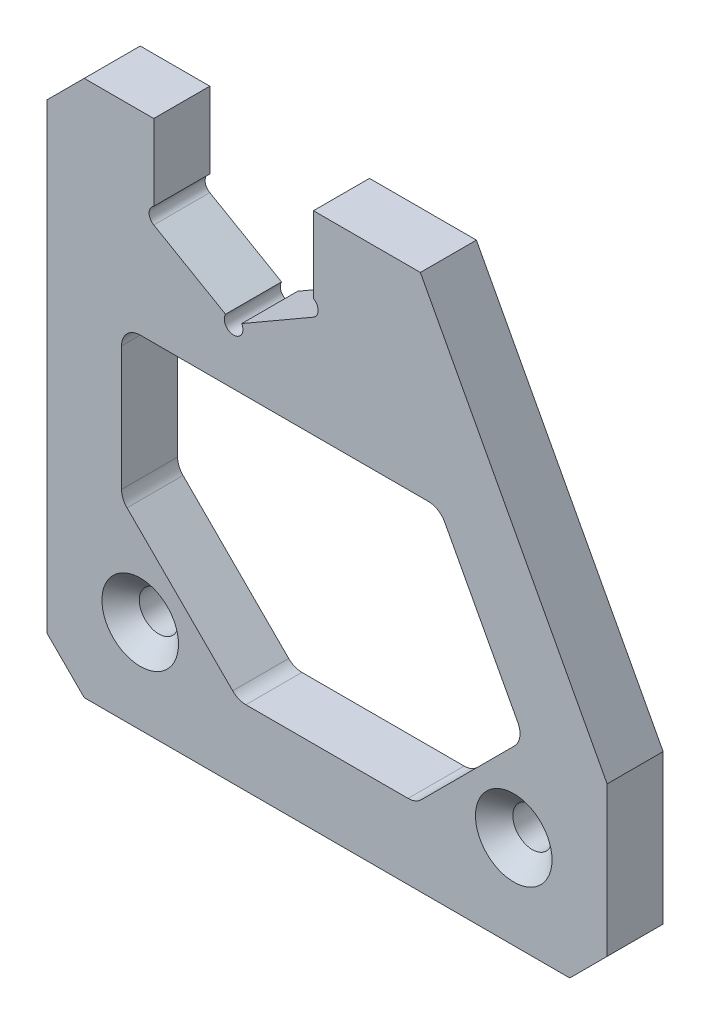
ISO-10303-21;
HEADER;
FILE_DESCRIPTION(('STEP AP214'),'2;1');
FILE_NAME('part.step','',(''),(''),'','','');
FILE_SCHEMA(('AUTOMOTIVE_DESIGN { 1 0 10303 214 1 1 1 1 }'));
ENDSEC;
DATA;
#1=APPLICATION_CONTEXT('core data for automotive mechanical design processes');
#2=APPLICATION_PROTOCOL_DEFINITION('international standard','automotive_design',2000,#1);
#3=PRODUCT_CONTEXT('',#1,'mechanical');
#4=PRODUCT('Part','Part','',(#3));
#5=PRODUCT_RELATED_PRODUCT_CATEGORY('part','',(#4));
#6=PRODUCT_DEFINITION_FORMATION('','',#4);
#7=PRODUCT_DEFINITION_CONTEXT('part definition',#1,'design');
#8=PRODUCT_DEFINITION('design','',#6,#7);
#9=PRODUCT_DEFINITION_SHAPE('','',#8);
#10=(LENGTH_UNIT() NAMED_UNIT(*) SI_UNIT(.MILLI.,.METRE.));
#11=(NAMED_UNIT(*) PLANE_ANGLE_UNIT() SI_UNIT($,.RADIAN.));
#12=(NAMED_UNIT(*) SI_UNIT($,.STERADIAN.) SOLID_ANGLE_UNIT());
#13=UNCERTAINTY_MEASURE_WITH_UNIT(LENGTH_MEASURE(1.E-05),#10,'distance_accuracy_value','');
#14=(GEOMETRIC_REPRESENTATION_CONTEXT(3) GLOBAL_UNCERTAINTY_ASSIGNED_CONTEXT((#13)) GLOBAL_UNIT_ASSIGNED_CONTEXT((#10,
#11,#12)) REPRESENTATION_CONTEXT('',''));
#15=CARTESIAN_POINT('',(0.,0.,0.));
#16=DIRECTION('',(0.,0.,1.));
#17=DIRECTION('',(1.,0.,0.));
#18=AXIS2_PLACEMENT_3D('',#15,#16,#17);
#19=CARTESIAN_POINT('',(0.,0.,3.));
#20=DIRECTION('',(0.,0.,1.));
#21=DIRECTION('',(1.,0.,0.));
#22=AXIS2_PLACEMENT_3D('',#19,#20,#21);
#23=PLANE('',#22);
#24=CARTESIAN_POINT('',(30.,-42.5,3.));
#25=DIRECTION('',(0.,0.,1.));
#26=DIRECTION('',(1.,0.,0.));
#27=AXIS2_PLACEMENT_3D('',#24,#25,#26);
#28=CIRCLE('',#27,4.10000000000001);
#29=CARTESIAN_POINT('',(34.1,-42.5,3.));
#30=VERTEX_POINT('',#29);
#31=EDGE_CURVE('E46',#30,#30,#28,.F.);
#32=ORIENTED_EDGE('',*,*,#31,.T.);
#33=EDGE_LOOP('',(#32));
#34=FACE_BOUND('',#33,.T.);
#35=CARTESIAN_POINT('',(-9.99999999999999,-42.5,3.));
#36=DIRECTION('',(0.,0.,1.));
#37=DIRECTION('',(1.,0.,0.));
#38=AXIS2_PLACEMENT_3D('',#35,#36,#37);
#39=CIRCLE('',#38,4.09999999999999);
#40=CARTESIAN_POINT('',(-5.90000000000001,-42.5,3.));
#41=VERTEX_POINT('',#40);
#42=EDGE_CURVE('E405',#41,#41,#39,.F.);
#43=ORIENTED_EDGE('',*,*,#42,.T.);
#44=EDGE_LOOP('',(#43));
#45=FACE_BOUND('',#44,.T.);
#46=DIRECTION('',(-1.,0.,0.));
#47=VECTOR('',#46,1.);
#48=CARTESIAN_POINT('',(-12.,-15.8726896031426,3.));
#49=LINE('',#48,#47);
#50=CARTESIAN_POINT('',(20.8478991758066,-15.8726896031426,3.));
#51=VERTEX_POINT('',#50);
#52=CARTESIAN_POINT('',(-10.,-15.8726896031426,3.));
#53=VERTEX_POINT('',#52);
#54=EDGE_CURVE('E458',#51,#53,#49,.T.);
#55=ORIENTED_EDGE('',*,*,#54,.F.);
#56=CARTESIAN_POINT('',(20.8478991758066,-17.8726896031426,3.));
#57=DIRECTION('',(0.,0.,1.));
#58=DIRECTION('',(1.,0.,0.));
#59=AXIS2_PLACEMENT_3D('',#56,#57,#58);
#60=CIRCLE('',#59,2.);
#61=CARTESIAN_POINT('',(22.6119403690712,-16.930267898986,3.));
#62=VERTEX_POINT('',#61);
#63=EDGE_CURVE('E395',#51,#62,#60,.F.);
#64=ORIENTED_EDGE('',*,*,#63,.T.);
#65=DIRECTION('',(-0.471210852078323,0.882020596632313,0.));
#66=VECTOR('',#65,1.);
#67=CARTESIAN_POINT('',(22.0469395382214,-15.8726896031426,3.));
#68=LINE('',#67,#66);
#69=CARTESIAN_POINT('',(30.4347580639227,-31.5731529262005,3.));
#70=VERTEX_POINT('',#69);
#71=EDGE_CURVE('E442',#70,#62,#68,.T.);
#72=ORIENTED_EDGE('',*,*,#71,.F.);
#73=CARTESIAN_POINT('',(28.670716870658,-32.5155746303572,3.));
#74=DIRECTION('',(0.,0.,1.));
#75=DIRECTION('',(1.,0.,0.));
#76=AXIS2_PLACEMENT_3D('',#73,#74,#75);
#77=CIRCLE('',#76,2.);
#78=CARTESIAN_POINT('',(30.0849304330311,-33.9297881927302,3.));
#79=VERTEX_POINT('',#78);
#80=EDGE_CURVE('E379',#70,#79,#77,.F.);
#81=ORIENTED_EDGE('',*,*,#80,.T.);
#82=DIRECTION('',(0.707106781186547,0.707106781186547,0.));
#83=VECTOR('',#82,1.);
#84=CARTESIAN_POINT('',(31.1335517084595,-32.8811669173019,3.));
#85=LINE('',#84,#83);
#86=CARTESIAN_POINT('',(20.1005050633883,-43.9142135623731,3.));
#87=VERTEX_POINT('',#86);
#88=EDGE_CURVE('E446',#87,#79,#85,.T.);
#89=ORIENTED_EDGE('',*,*,#88,.F.);
#90=CARTESIAN_POINT('',(18.6862915010152,-42.5,3.));
#91=DIRECTION('',(0.,0.,1.));
#92=DIRECTION('',(1.,0.,0.));
#93=AXIS2_PLACEMENT_3D('',#90,#91,#92);
#94=CIRCLE('',#93,2.);
#95=CARTESIAN_POINT('',(18.6862915010152,-44.5,3.));
#96=VERTEX_POINT('',#95);
#97=EDGE_CURVE('E383',#87,#96,#94,.F.);
#98=ORIENTED_EDGE('',*,*,#97,.T.);
#99=DIRECTION('',(1.,0.,0.));
#100=VECTOR('',#99,1.);
#101=CARTESIAN_POINT('',(19.5147186257614,-44.5,3.));
#102=LINE('',#101,#100);
#103=CARTESIAN_POINT('',(1.31370849898476,-44.5,3.));
#104=VERTEX_POINT('',#103);
#105=EDGE_CURVE('E449',#104,#96,#102,.T.);
#106=ORIENTED_EDGE('',*,*,#105,.F.);
#107=CARTESIAN_POINT('',(1.31370849898476,-42.5,3.));
#108=DIRECTION('',(0.,0.,1.));
#109=DIRECTION('',(1.,0.,0.));
#110=AXIS2_PLACEMENT_3D('',#107,#108,#109);
#111=CIRCLE('',#110,2.);
#112=CARTESIAN_POINT('',(-0.100505063388337,-43.9142135623731,3.));
#113=VERTEX_POINT('',#112);
#114=EDGE_CURVE('E387',#104,#113,#111,.F.);
#115=ORIENTED_EDGE('',*,*,#114,.T.);
#116=DIRECTION('',(0.707106781186548,-0.707106781186547,0.));
#117=VECTOR('',#116,1.);
#118=CARTESIAN_POINT('',(0.485281374238568,-44.5,3.));
#119=LINE('',#118,#117);
#120=CARTESIAN_POINT('',(-11.4142135623731,-32.6005050633883,3.));
#121=VERTEX_POINT('',#120);
#122=EDGE_CURVE('E452',#121,#113,#119,.T.);
#123=ORIENTED_EDGE('',*,*,#122,.F.);
#124=CARTESIAN_POINT('',(-10.,-31.1862915010152,3.));
#125=DIRECTION('',(0.,0.,1.));
#126=DIRECTION('',(1.,0.,0.));
#127=AXIS2_PLACEMENT_3D('',#124,#125,#126);
#128=CIRCLE('',#127,2.);
#129=CARTESIAN_POINT('',(-12.,-31.1862915010152,3.));
#130=VERTEX_POINT('',#129);
#131=EDGE_CURVE('E391',#121,#130,#128,.F.);
#132=ORIENTED_EDGE('',*,*,#131,.T.);
#133=DIRECTION('',(0.,-1.,0.));
#134=VECTOR('',#133,1.);
#135=CARTESIAN_POINT('',(-12.,-15.8726896031426,3.));
#136=LINE('',#135,#134);
#137=CARTESIAN_POINT('',(-12.,-17.8726896031426,3.));
#138=VERTEX_POINT('',#137);
#139=EDGE_CURVE('E455',#138,#130,#136,.T.);
#140=ORIENTED_EDGE('',*,*,#139,.F.);
#141=CARTESIAN_POINT('',(-10.,-17.8726896031426,3.));
#142=DIRECTION('',(0.,0.,1.));
#143=DIRECTION('',(1.,0.,0.));
#144=AXIS2_PLACEMENT_3D('',#141,#142,#143);
#145=CIRCLE('',#144,2.);
#146=EDGE_CURVE('E398',#138,#53,#145,.F.);
#147=ORIENTED_EDGE('',*,*,#146,.T.);
#148=EDGE_LOOP('',(#55,#64,#72,#81,#89,#98,#106,#115,#123,#132,#140,#147));
#149=FACE_BOUND('',#148,.T.);
#150=CARTESIAN_POINT('',(-8.04999999999992,-4.07031939778692,3.));
#151=DIRECTION('',(0.,0.,1.));
#152=DIRECTION('',(1.,0.,0.));
#153=AXIS2_PLACEMENT_3D('',#150,#151,#152);
#154=CIRCLE('',#153,1.);
#155=CARTESIAN_POINT('',(-8.54999999999997,-3.2042939940025,3.));
#156=VERTEX_POINT('',#155);
#157=CARTESIAN_POINT('',(-8.54999999999995,-4.93634480157134,3.));
#158=VERTEX_POINT('',#157);
#159=EDGE_CURVE('E438',#156,#158,#154,.T.);
#160=ORIENTED_EDGE('',*,*,#159,.F.);
#161=DIRECTION('',(0.,1.,0.));
#162=VECTOR('',#161,1.);
#163=CARTESIAN_POINT('',(-8.55000000000005,4.93634480157122,3.));
#164=LINE('',#163,#162);
#165=CARTESIAN_POINT('',(-8.55000000000005,4.93634480157122,3.));
#166=VERTEX_POINT('',#165);
#167=EDGE_CURVE('E251',#156,#166,#164,.T.);
#168=ORIENTED_EDGE('',*,*,#167,.T.);
#169=DIRECTION('',(-1.,0.,0.));
#170=VECTOR('',#169,1.);
#171=CARTESIAN_POINT('',(-8.55000000000005,4.93634480157122,3.));
#172=LINE('',#171,#170);
#173=CARTESIAN_POINT('',(-16.,4.93634480157122,3.));
#174=VERTEX_POINT('',#173);
#175=EDGE_CURVE('E254',#166,#174,#172,.T.);
#176=ORIENTED_EDGE('',*,*,#175,.T.);
#177=DIRECTION('',(0.707106781186549,0.707106781186546,0.));
#178=VECTOR('',#177,1.);
#179=CARTESIAN_POINT('',(-10.4681724007856,10.4681724007856,3.));
#180=LINE('',#179,#178);
#181=CARTESIAN_POINT('',(-20.,0.936344801571235,3.));
#182=VERTEX_POINT('',#181);
#183=EDGE_CURVE('E332',#174,#182,#180,.F.);
#184=ORIENTED_EDGE('',*,*,#183,.T.);
#185=DIRECTION('',(0.,-1.,0.));
#186=VECTOR('',#185,1.);
#187=CARTESIAN_POINT('',(-20.,4.93634480157122,3.));
#188=LINE('',#187,#186);
#189=CARTESIAN_POINT('',(-20.,-48.5,3.));
#190=VERTEX_POINT('',#189);
#191=EDGE_CURVE('E265',#182,#190,#188,.T.);
#192=ORIENTED_EDGE('',*,*,#191,.T.);
#193=DIRECTION('',(-0.707106781186546,0.707106781186549,0.));
#194=VECTOR('',#193,1.);
#195=CARTESIAN_POINT('',(-34.25,-34.2499999999999,3.));
#196=LINE('',#195,#194);
#197=CARTESIAN_POINT('',(-16.,-52.5,3.));
#198=VERTEX_POINT('',#197);
#199=EDGE_CURVE('E334',#190,#198,#196,.F.);
#200=ORIENTED_EDGE('',*,*,#199,.T.);
#201=DIRECTION('',(1.,0.,0.));
#202=VECTOR('',#201,1.);
#203=CARTESIAN_POINT('',(-20.,-52.5,3.));
#204=LINE('',#203,#202);
#205=CARTESIAN_POINT('',(36.,-52.5,3.));
#206=VERTEX_POINT('',#205);
#207=EDGE_CURVE('E268',#198,#206,#204,.T.);
#208=ORIENTED_EDGE('',*,*,#207,.T.);
#209=DIRECTION('',(-0.70710678118655,-0.707106781186545,0.));
#210=VECTOR('',#209,1.);
#211=CARTESIAN_POINT('',(44.2499999999999,-44.2500000000002,3.));
#212=LINE('',#211,#210);
#213=CARTESIAN_POINT('',(40.,-48.5,3.));
#214=VERTEX_POINT('',#213);
#215=EDGE_CURVE('E336',#206,#214,#212,.F.);
#216=ORIENTED_EDGE('',*,*,#215,.T.);
#217=DIRECTION('',(0.,1.,0.));
#218=VECTOR('',#217,1.);
#219=CARTESIAN_POINT('',(40.,-32.5,3.));
#220=LINE('',#219,#218);
#221=CARTESIAN_POINT('',(40.,-32.5,3.));
#222=VERTEX_POINT('',#221);
#223=EDGE_CURVE('E271',#214,#222,#220,.T.);
#224=ORIENTED_EDGE('',*,*,#223,.T.);
#225=DIRECTION('',(-0.471210852078323,0.882020596632313,0.));
#226=VECTOR('',#225,1.);
#227=CARTESIAN_POINT('',(20.,4.93634480157133,3.));
#228=LINE('',#227,#226);
#229=CARTESIAN_POINT('',(20.,4.93634480157133,3.));
#230=VERTEX_POINT('',#229);
#231=EDGE_CURVE('E273',#222,#230,#228,.T.);
#232=ORIENTED_EDGE('',*,*,#231,.T.);
#233=DIRECTION('',(-1.,0.,0.));
#234=VECTOR('',#233,1.);
#235=CARTESIAN_POINT('',(8.54999999999998,4.93634480157134,3.));
#236=LINE('',#235,#234);
#237=CARTESIAN_POINT('',(8.54999999999998,4.93634480157134,3.));
#238=VERTEX_POINT('',#237);
#239=EDGE_CURVE('E275',#230,#238,#236,.T.);
#240=ORIENTED_EDGE('',*,*,#239,.T.);
#241=DIRECTION('',(0.,-1.,0.));
#242=VECTOR('',#241,1.);
#243=CARTESIAN_POINT('',(8.55000000000002,-4.93634480157128,3.));
#244=LINE('',#243,#242);
#245=CARTESIAN_POINT('',(8.55000000000001,-3.2042939940024,3.));
#246=VERTEX_POINT('',#245);
#247=EDGE_CURVE('E277',#238,#246,#244,.T.);
#248=ORIENTED_EDGE('',*,*,#247,.T.);
#249=CARTESIAN_POINT('',(8.05000000000002,-4.07031939778685,3.));
#250=DIRECTION('',(0.,0.,1.));
#251=DIRECTION('',(1.,0.,0.));
#252=AXIS2_PLACEMENT_3D('',#249,#250,#251);
#253=CIRCLE('',#252,1.);
#254=CARTESIAN_POINT('',(8.55000000000002,-4.93634480157128,3.));
#255=VERTEX_POINT('',#254);
#256=EDGE_CURVE('E433',#255,#246,#253,.T.);
#257=ORIENTED_EDGE('',*,*,#256,.F.);
#258=DIRECTION('',(-0.866025403784438,-0.500000000000001,0.));
#259=VECTOR('',#258,1.);
#260=CARTESIAN_POINT('',(0.,-9.87268960314261,3.));
#261=LINE('',#260,#259);
#262=CARTESIAN_POINT('',(0.866025403784438,-9.37268960314261,3.));
#263=VERTEX_POINT('',#262);
#264=EDGE_CURVE('E246',#255,#263,#261,.T.);
#265=ORIENTED_EDGE('',*,*,#264,.T.);
#266=CARTESIAN_POINT('',(0.,-9.87268960314261,3.));
#267=DIRECTION('',(0.,0.,1.));
#268=DIRECTION('',(1.,0.,0.));
#269=AXIS2_PLACEMENT_3D('',#266,#267,#268);
#270=CIRCLE('',#269,1.);
#271=CARTESIAN_POINT('',(-0.866025403784443,-9.37268960314261,3.));
#272=VERTEX_POINT('',#271);
#273=EDGE_CURVE('E227',#272,#263,#270,.T.);
#274=ORIENTED_EDGE('',*,*,#273,.F.);
#275=DIRECTION('',(-0.866025403784441,0.499999999999995,0.));
#276=VECTOR('',#275,1.);
#277=CARTESIAN_POINT('',(-8.54999999999995,-4.9363448015714,3.));
#278=LINE('',#277,#276);
#279=EDGE_CURVE('E242',#272,#158,#278,.T.);
#280=ORIENTED_EDGE('',*,*,#279,.T.);
#281=EDGE_LOOP('',(#160,#168,#176,#184,#192,#200,#208,#216,#224,#232,#240,#248,#257,#265,#274,#280));
#282=FACE_BOUND('',#281,.T.);
#283=ADVANCED_FACE('F37',(#34,#45,#149,#282),#23,.T.);
#284=CARTESIAN_POINT('',(0.,0.,-3.));
#285=DIRECTION('',(0.,0.,1.));
#286=DIRECTION('',(1.,0.,0.));
#287=AXIS2_PLACEMENT_3D('',#284,#285,#286);
#288=PLANE('',#287);
#289=DIRECTION('',(0.707106781186547,0.707106781186547,0.));
#290=VECTOR('',#289,1.);
#291=CARTESIAN_POINT('',(31.1335517084595,-32.8811669173019,-3.));
#292=LINE('',#291,#290);
#293=CARTESIAN_POINT('',(20.1005050633883,-43.9142135623731,-3.));
#294=VERTEX_POINT('',#293);
#295=CARTESIAN_POINT('',(30.0849304330311,-33.9297881927302,-3.));
#296=VERTEX_POINT('',#295);
#297=EDGE_CURVE('E461',#294,#296,#292,.T.);
#298=ORIENTED_EDGE('',*,*,#297,.T.);
#299=CARTESIAN_POINT('',(28.670716870658,-32.5155746303572,-3.));
#300=DIRECTION('',(0.,0.,1.));
#301=DIRECTION('',(1.,0.,0.));
#302=AXIS2_PLACEMENT_3D('',#299,#300,#301);
#303=CIRCLE('',#302,2.);
#304=CARTESIAN_POINT('',(30.4347580639227,-31.5731529262005,-3.));
#305=VERTEX_POINT('',#304);
#306=EDGE_CURVE('E381',#296,#305,#303,.T.);
#307=ORIENTED_EDGE('',*,*,#306,.T.);
#308=DIRECTION('',(-0.471210852078323,0.882020596632313,0.));
#309=VECTOR('',#308,1.);
#310=CARTESIAN_POINT('',(22.0469395382214,-15.8726896031426,-3.));
#311=LINE('',#310,#309);
#312=CARTESIAN_POINT('',(22.6119403690712,-16.930267898986,-3.));
#313=VERTEX_POINT('',#312);
#314=EDGE_CURVE('E247',#305,#313,#311,.T.);
#315=ORIENTED_EDGE('',*,*,#314,.T.);
#316=CARTESIAN_POINT('',(20.8478991758066,-17.8726896031426,-3.));
#317=DIRECTION('',(0.,0.,1.));
#318=DIRECTION('',(1.,0.,0.));
#319=AXIS2_PLACEMENT_3D('',#316,#317,#318);
#320=CIRCLE('',#319,2.);
#321=CARTESIAN_POINT('',(20.8478991758066,-15.8726896031426,-3.));
#322=VERTEX_POINT('',#321);
#323=EDGE_CURVE('E60',#313,#322,#320,.T.);
#324=ORIENTED_EDGE('',*,*,#323,.T.);
#325=DIRECTION('',(-1.,0.,0.));
#326=VECTOR('',#325,1.);
#327=CARTESIAN_POINT('',(-12.,-15.8726896031426,-3.));
#328=LINE('',#327,#326);
#329=CARTESIAN_POINT('',(-10.,-15.8726896031426,-3.));
#330=VERTEX_POINT('',#329);
#331=EDGE_CURVE('E445',#322,#330,#328,.T.);
#332=ORIENTED_EDGE('',*,*,#331,.T.);
#333=CARTESIAN_POINT('',(-10.,-17.8726896031426,-3.));
#334=DIRECTION('',(0.,0.,1.));
#335=DIRECTION('',(1.,0.,0.));
#336=AXIS2_PLACEMENT_3D('',#333,#334,#335);
#337=CIRCLE('',#336,2.);
#338=CARTESIAN_POINT('',(-12.,-17.8726896031426,-3.));
#339=VERTEX_POINT('',#338);
#340=EDGE_CURVE('E400',#330,#339,#337,.T.);
#341=ORIENTED_EDGE('',*,*,#340,.T.);
#342=DIRECTION('',(0.,-1.,0.));
#343=VECTOR('',#342,1.);
#344=CARTESIAN_POINT('',(-12.,-15.8726896031426,-3.));
#345=LINE('',#344,#343);
#346=CARTESIAN_POINT('',(-12.,-31.1862915010152,-3.));
#347=VERTEX_POINT('',#346);
#348=EDGE_CURVE('E470',#339,#347,#345,.T.);
#349=ORIENTED_EDGE('',*,*,#348,.T.);
#350=CARTESIAN_POINT('',(-10.,-31.1862915010152,-3.));
#351=DIRECTION('',(0.,0.,1.));
#352=DIRECTION('',(1.,0.,0.));
#353=AXIS2_PLACEMENT_3D('',#350,#351,#352);
#354=CIRCLE('',#353,2.);
#355=CARTESIAN_POINT('',(-11.4142135623731,-32.6005050633883,-3.));
#356=VERTEX_POINT('',#355);
#357=EDGE_CURVE('E393',#347,#356,#354,.T.);
#358=ORIENTED_EDGE('',*,*,#357,.T.);
#359=DIRECTION('',(0.707106781186548,-0.707106781186547,0.));
#360=VECTOR('',#359,1.);
#361=CARTESIAN_POINT('',(0.485281374238568,-44.5,-3.));
#362=LINE('',#361,#360);
#363=CARTESIAN_POINT('',(-0.100505063388337,-43.9142135623731,-3.));
#364=VERTEX_POINT('',#363);
#365=EDGE_CURVE('E467',#356,#364,#362,.T.);
#366=ORIENTED_EDGE('',*,*,#365,.T.);
#367=CARTESIAN_POINT('',(1.31370849898476,-42.5,-3.));
#368=DIRECTION('',(0.,0.,1.));
#369=DIRECTION('',(1.,0.,0.));
#370=AXIS2_PLACEMENT_3D('',#367,#368,#369);
#371=CIRCLE('',#370,2.);
#372=CARTESIAN_POINT('',(1.31370849898476,-44.5,-3.));
#373=VERTEX_POINT('',#372);
#374=EDGE_CURVE('E389',#364,#373,#371,.T.);
#375=ORIENTED_EDGE('',*,*,#374,.T.);
#376=DIRECTION('',(1.,0.,0.));
#377=VECTOR('',#376,1.);
#378=CARTESIAN_POINT('',(19.5147186257614,-44.5,-3.));
#379=LINE('',#378,#377);
#380=CARTESIAN_POINT('',(18.6862915010152,-44.5,-3.));
#381=VERTEX_POINT('',#380);
#382=EDGE_CURVE('E464',#373,#381,#379,.T.);
#383=ORIENTED_EDGE('',*,*,#382,.T.);
#384=CARTESIAN_POINT('',(18.6862915010152,-42.5,-3.));
#385=DIRECTION('',(0.,0.,1.));
#386=DIRECTION('',(1.,0.,0.));
#387=AXIS2_PLACEMENT_3D('',#384,#385,#386);
#388=CIRCLE('',#387,2.);
#389=EDGE_CURVE('E385',#381,#294,#388,.T.);
#390=ORIENTED_EDGE('',*,*,#389,.T.);
#391=EDGE_LOOP('',(#298,#307,#315,#324,#332,#341,#349,#358,#366,#375,#383,#390));
#392=FACE_BOUND('',#391,.T.);
#393=DIRECTION('',(0.,1.,0.));
#394=VECTOR('',#393,1.);
#395=CARTESIAN_POINT('',(-8.55000000000005,4.93634480157122,-3.));
#396=LINE('',#395,#394);
#397=CARTESIAN_POINT('',(-8.54999999999997,-3.2042939940025,-3.));
#398=VERTEX_POINT('',#397);
#399=CARTESIAN_POINT('',(-8.55000000000005,4.93634480157122,-3.));
#400=VERTEX_POINT('',#399);
#401=EDGE_CURVE('E284',#398,#400,#396,.T.);
#402=ORIENTED_EDGE('',*,*,#401,.F.);
#403=CARTESIAN_POINT('',(-8.04999999999992,-4.07031939778692,-3.));
#404=DIRECTION('',(0.,0.,1.));
#405=DIRECTION('',(1.,0.,0.));
#406=AXIS2_PLACEMENT_3D('',#403,#404,#405);
#407=CIRCLE('',#406,1.);
#408=CARTESIAN_POINT('',(-8.54999999999995,-4.93634480157134,-3.));
#409=VERTEX_POINT('',#408);
#410=EDGE_CURVE('E236',#398,#409,#407,.T.);
#411=ORIENTED_EDGE('',*,*,#410,.T.);
#412=DIRECTION('',(-0.866025403784441,0.499999999999995,0.));
#413=VECTOR('',#412,1.);
#414=CARTESIAN_POINT('',(-8.54999999999995,-4.9363448015714,-3.));
#415=LINE('',#414,#413);
#416=CARTESIAN_POINT('',(-0.866025403784443,-9.37268960314261,-3.));
#417=VERTEX_POINT('',#416);
#418=EDGE_CURVE('E282',#417,#409,#415,.T.);
#419=ORIENTED_EDGE('',*,*,#418,.F.);
#420=CARTESIAN_POINT('',(0.,-9.87268960314261,-3.));
#421=DIRECTION('',(0.,0.,1.));
#422=DIRECTION('',(1.,0.,0.));
#423=AXIS2_PLACEMENT_3D('',#420,#421,#422);
#424=CIRCLE('',#423,1.);
#425=CARTESIAN_POINT('',(0.866025403784439,-9.37268960314261,-3.));
#426=VERTEX_POINT('',#425);
#427=EDGE_CURVE('E230',#417,#426,#424,.T.);
#428=ORIENTED_EDGE('',*,*,#427,.T.);
#429=DIRECTION('',(-0.866025403784438,-0.500000000000001,0.));
#430=VECTOR('',#429,1.);
#431=CARTESIAN_POINT('',(0.,-9.87268960314261,-3.));
#432=LINE('',#431,#430);
#433=CARTESIAN_POINT('',(8.55000000000002,-4.93634480157128,-3.));
#434=VERTEX_POINT('',#433);
#435=EDGE_CURVE('E252',#434,#426,#432,.T.);
#436=ORIENTED_EDGE('',*,*,#435,.F.);
#437=CARTESIAN_POINT('',(8.05000000000002,-4.07031939778685,-3.));
#438=DIRECTION('',(0.,0.,1.));
#439=DIRECTION('',(1.,0.,0.));
#440=AXIS2_PLACEMENT_3D('',#437,#438,#439);
#441=CIRCLE('',#440,1.);
#442=CARTESIAN_POINT('',(8.55000000000001,-3.2042939940024,-3.));
#443=VERTEX_POINT('',#442);
#444=EDGE_CURVE('E435',#434,#443,#441,.T.);
#445=ORIENTED_EDGE('',*,*,#444,.T.);
#446=DIRECTION('',(0.,-1.,0.));
#447=VECTOR('',#446,1.);
#448=CARTESIAN_POINT('',(8.55000000000002,-4.93634480157128,-3.));
#449=LINE('',#448,#447);
#450=CARTESIAN_POINT('',(8.54999999999998,4.93634480157134,-3.));
#451=VERTEX_POINT('',#450);
#452=EDGE_CURVE('E257',#451,#443,#449,.T.);
#453=ORIENTED_EDGE('',*,*,#452,.F.);
#454=DIRECTION('',(-1.,0.,0.));
#455=VECTOR('',#454,1.);
#456=CARTESIAN_POINT('',(8.54999999999998,4.93634480157134,-3.));
#457=LINE('',#456,#455);
#458=CARTESIAN_POINT('',(20.,4.93634480157133,-3.));
#459=VERTEX_POINT('',#458);
#460=EDGE_CURVE('E299',#459,#451,#457,.T.);
#461=ORIENTED_EDGE('',*,*,#460,.F.);
#462=DIRECTION('',(-0.471210852078323,0.882020596632313,0.));
#463=VECTOR('',#462,1.);
#464=CARTESIAN_POINT('',(20.,4.93634480157133,-3.));
#465=LINE('',#464,#463);
#466=CARTESIAN_POINT('',(40.,-32.5,-3.));
#467=VERTEX_POINT('',#466);
#468=EDGE_CURVE('E297',#467,#459,#465,.T.);
#469=ORIENTED_EDGE('',*,*,#468,.F.);
#470=DIRECTION('',(0.,1.,0.));
#471=VECTOR('',#470,1.);
#472=CARTESIAN_POINT('',(40.,-32.5,-3.));
#473=LINE('',#472,#471);
#474=CARTESIAN_POINT('',(40.,-48.5,-3.));
#475=VERTEX_POINT('',#474);
#476=EDGE_CURVE('E295',#475,#467,#473,.T.);
#477=ORIENTED_EDGE('',*,*,#476,.F.);
#478=DIRECTION('',(0.70710678118655,0.707106781186545,0.));
#479=VECTOR('',#478,1.);
#480=CARTESIAN_POINT('',(40.,-48.5,-3.));
#481=LINE('',#480,#479);
#482=CARTESIAN_POINT('',(36.,-52.5,-3.));
#483=VERTEX_POINT('',#482);
#484=EDGE_CURVE('E325',#475,#483,#481,.F.);
#485=ORIENTED_EDGE('',*,*,#484,.T.);
#486=DIRECTION('',(1.,0.,0.));
#487=VECTOR('',#486,1.);
#488=CARTESIAN_POINT('',(-20.,-52.5,-3.));
#489=LINE('',#488,#487);
#490=CARTESIAN_POINT('',(-16.,-52.5,-3.));
#491=VERTEX_POINT('',#490);
#492=EDGE_CURVE('E292',#491,#483,#489,.T.);
#493=ORIENTED_EDGE('',*,*,#492,.F.);
#494=DIRECTION('',(0.707106781186546,-0.707106781186549,0.));
#495=VECTOR('',#494,1.);
#496=CARTESIAN_POINT('',(-16.,-52.5,-3.));
#497=LINE('',#496,#495);
#498=CARTESIAN_POINT('',(-20.,-48.5,-3.));
#499=VERTEX_POINT('',#498);
#500=EDGE_CURVE('E323',#491,#499,#497,.F.);
#501=ORIENTED_EDGE('',*,*,#500,.T.);
#502=DIRECTION('',(0.,-1.,0.));
#503=VECTOR('',#502,1.);
#504=CARTESIAN_POINT('',(-20.,4.93634480157122,-3.));
#505=LINE('',#504,#503);
#506=CARTESIAN_POINT('',(-20.,0.936344801571235,-3.));
#507=VERTEX_POINT('',#506);
#508=EDGE_CURVE('E289',#507,#499,#505,.T.);
#509=ORIENTED_EDGE('',*,*,#508,.F.);
#510=DIRECTION('',(-0.707106781186549,-0.707106781186546,0.));
#511=VECTOR('',#510,1.);
#512=CARTESIAN_POINT('',(-20.,0.936344801571235,-3.));
#513=LINE('',#512,#511);
#514=CARTESIAN_POINT('',(-16.,4.93634480157122,-3.));
#515=VERTEX_POINT('',#514);
#516=EDGE_CURVE('E321',#507,#515,#513,.F.);
#517=ORIENTED_EDGE('',*,*,#516,.T.);
#518=DIRECTION('',(-1.,0.,0.));
#519=VECTOR('',#518,1.);
#520=CARTESIAN_POINT('',(-8.55000000000005,4.93634480157122,-3.));
#521=LINE('',#520,#519);
#522=EDGE_CURVE('E286',#400,#515,#521,.T.);
#523=ORIENTED_EDGE('',*,*,#522,.F.);
#524=EDGE_LOOP('',(#402,#411,#419,#428,#436,#445,#453,#461,#469,#477,#485,#493,#501,#509,#517,#523));
#525=FACE_BOUND('',#524,.T.);
#526=CARTESIAN_POINT('',(-9.99999999999999,-42.5,-3.));
#527=DIRECTION('',(0.,0.,1.));
#528=DIRECTION('',(1.,0.,0.));
#529=AXIS2_PLACEMENT_3D('',#526,#527,#528);
#530=CIRCLE('',#529,2.1);
#531=CARTESIAN_POINT('',(-7.9,-42.5,-3.));
#532=VERTEX_POINT('',#531);
#533=EDGE_CURVE('E260',#532,#532,#530,.T.);
#534=ORIENTED_EDGE('',*,*,#533,.T.);
#535=EDGE_LOOP('',(#534));
#536=FACE_BOUND('',#535,.T.);
#537=CARTESIAN_POINT('',(30.,-42.5,-3.));
#538=DIRECTION('',(0.,0.,1.));
#539=DIRECTION('',(1.,0.,0.));
#540=AXIS2_PLACEMENT_3D('',#537,#538,#539);
#541=CIRCLE('',#540,2.1);
#542=CARTESIAN_POINT('',(32.1,-42.5,-3.));
#543=VERTEX_POINT('',#542);
#544=EDGE_CURVE('E426',#543,#543,#541,.T.);
#545=ORIENTED_EDGE('',*,*,#544,.T.);
#546=EDGE_LOOP('',(#545));
#547=FACE_BOUND('',#546,.T.);
#548=ADVANCED_FACE('F474',(#392,#525,#536,#547),#288,.F.);
#549=CARTESIAN_POINT('',(-8.54999999999995,-4.9363448015714,3.));
#550=DIRECTION('',(-0.499999999999995,-0.866025403784442,0.));
#551=DIRECTION('',(0.866025403784442,-0.499999999999995,0.));
#552=AXIS2_PLACEMENT_3D('',#549,#550,#551);
#553=PLANE('',#552);
#554=ORIENTED_EDGE('',*,*,#279,.F.);
#555=DIRECTION('',(0.,0.,1.));
#556=VECTOR('',#555,1.);
#557=CARTESIAN_POINT('',(-0.866025403784443,-9.37268960314261,-3.));
#558=LINE('',#557,#556);
#559=EDGE_CURVE('E224',#272,#417,#558,.F.);
#560=ORIENTED_EDGE('',*,*,#559,.T.);
#561=ORIENTED_EDGE('',*,*,#418,.T.);
#562=DIRECTION('',(0.,0.,-1.));
#563=VECTOR('',#562,1.);
#564=CARTESIAN_POINT('',(-8.54999999999995,-4.9363448015714,3.));
#565=LINE('',#564,#563);
#566=EDGE_CURVE('E250',#158,#409,#565,.T.);
#567=ORIENTED_EDGE('',*,*,#566,.F.);
#568=EDGE_LOOP('',(#554,#560,#561,#567));
#569=FACE_BOUND('',#568,.T.);
#570=ADVANCED_FACE('F249',(#569),#553,.F.);
#571=CARTESIAN_POINT('',(-8.55000000000005,4.93634480157122,3.));
#572=DIRECTION('',(-1.,0.,0.));
#573=DIRECTION('',(0.,-1.,0.));
#574=AXIS2_PLACEMENT_3D('',#571,#572,#573);
#575=PLANE('',#574);
#576=ORIENTED_EDGE('',*,*,#167,.F.);
#577=DIRECTION('',(0.,0.,1.));
#578=VECTOR('',#577,1.);
#579=CARTESIAN_POINT('',(-8.54999999999997,-3.2042939940025,-3.));
#580=LINE('',#579,#578);
#581=EDGE_CURVE('E347',#156,#398,#580,.F.);
#582=ORIENTED_EDGE('',*,*,#581,.T.);
#583=ORIENTED_EDGE('',*,*,#401,.T.);
#584=DIRECTION('',(0.,0.,-1.));
#585=VECTOR('',#584,1.);
#586=CARTESIAN_POINT('',(-8.55000000000005,4.93634480157122,3.));
#587=LINE('',#586,#585);
#588=EDGE_CURVE('E314',#166,#400,#587,.T.);
#589=ORIENTED_EDGE('',*,*,#588,.F.);
#590=EDGE_LOOP('',(#576,#582,#583,#589));
#591=FACE_BOUND('',#590,.T.);
#592=ADVANCED_FACE('F576',(#591),#575,.F.);
#593=CARTESIAN_POINT('',(-8.55000000000005,4.93634480157122,3.));
#594=DIRECTION('',(0.,-1.,0.));
#595=DIRECTION('',(0.,0.,-1.));
#596=AXIS2_PLACEMENT_3D('',#593,#594,#595);
#597=PLANE('',#596);
#598=ORIENTED_EDGE('',*,*,#522,.T.);
#599=DIRECTION('',(0.,0.,1.));
#600=VECTOR('',#599,1.);
#601=CARTESIAN_POINT('',(-16.,4.93634480157122,3.));
#602=LINE('',#601,#600);
#603=EDGE_CURVE('E343',#515,#174,#602,.T.);
#604=ORIENTED_EDGE('',*,*,#603,.T.);
#605=ORIENTED_EDGE('',*,*,#175,.F.);
#606=ORIENTED_EDGE('',*,*,#588,.T.);
#607=EDGE_LOOP('',(#598,#604,#605,#606));
#608=FACE_BOUND('',#607,.T.);
#609=ADVANCED_FACE('F572',(#608),#597,.F.);
#610=CARTESIAN_POINT('',(-20.,4.93634480157122,3.));
#611=DIRECTION('',(1.,0.,0.));
#612=DIRECTION('',(0.,1.,0.));
#613=AXIS2_PLACEMENT_3D('',#610,#611,#612);
#614=PLANE('',#613);
#615=ORIENTED_EDGE('',*,*,#508,.T.);
#616=DIRECTION('',(0.,0.,1.));
#617=VECTOR('',#616,1.);
#618=CARTESIAN_POINT('',(-20.,-48.5,3.));
#619=LINE('',#618,#617);
#620=EDGE_CURVE('E341',#499,#190,#619,.T.);
#621=ORIENTED_EDGE('',*,*,#620,.T.);
#622=ORIENTED_EDGE('',*,*,#191,.F.);
#623=DIRECTION('',(0.,0.,-1.));
#624=VECTOR('',#623,1.);
#625=CARTESIAN_POINT('',(-20.,0.936344801571235,3.));
#626=LINE('',#625,#624);
#627=EDGE_CURVE('E338',#182,#507,#626,.T.);
#628=ORIENTED_EDGE('',*,*,#627,.T.);
#629=EDGE_LOOP('',(#615,#621,#622,#628));
#630=FACE_BOUND('',#629,.T.);
#631=ADVANCED_FACE('F568',(#630),#614,.F.);
#632=CARTESIAN_POINT('',(-20.,-52.5,3.));
#633=DIRECTION('',(0.,1.,0.));
#634=DIRECTION('',(0.,0.,1.));
#635=AXIS2_PLACEMENT_3D('',#632,#633,#634);
#636=PLANE('',#635);
#637=ORIENTED_EDGE('',*,*,#492,.T.);
#638=DIRECTION('',(0.,0.,1.));
#639=VECTOR('',#638,1.);
#640=CARTESIAN_POINT('',(36.,-52.5,3.));
#641=LINE('',#640,#639);
#642=EDGE_CURVE('E330',#483,#206,#641,.T.);
#643=ORIENTED_EDGE('',*,*,#642,.T.);
#644=ORIENTED_EDGE('',*,*,#207,.F.);
#645=DIRECTION('',(0.,0.,-1.));
#646=VECTOR('',#645,1.);
#647=CARTESIAN_POINT('',(-16.,-52.5,3.));
#648=LINE('',#647,#646);
#649=EDGE_CURVE('E327',#198,#491,#648,.T.);
#650=ORIENTED_EDGE('',*,*,#649,.T.);
#651=EDGE_LOOP('',(#637,#643,#644,#650));
#652=FACE_BOUND('',#651,.T.);
#653=ADVANCED_FACE('F564',(#652),#636,.F.);
#654=CARTESIAN_POINT('',(40.,-32.5,3.));
#655=DIRECTION('',(-1.,0.,0.));
#656=DIRECTION('',(0.,-1.,0.));
#657=AXIS2_PLACEMENT_3D('',#654,#655,#656);
#658=PLANE('',#657);
#659=ORIENTED_EDGE('',*,*,#223,.F.);
#660=DIRECTION('',(0.,0.,-1.));
#661=VECTOR('',#660,1.);
#662=CARTESIAN_POINT('',(40.,-48.5,3.));
#663=LINE('',#662,#661);
#664=EDGE_CURVE('E318',#214,#475,#663,.T.);
#665=ORIENTED_EDGE('',*,*,#664,.T.);
#666=ORIENTED_EDGE('',*,*,#476,.T.);
#667=DIRECTION('',(0.,0.,-1.));
#668=VECTOR('',#667,1.);
#669=CARTESIAN_POINT('',(40.,-32.5,3.));
#670=LINE('',#669,#668);
#671=EDGE_CURVE('E311',#222,#467,#670,.T.);
#672=ORIENTED_EDGE('',*,*,#671,.F.);
#673=EDGE_LOOP('',(#659,#665,#666,#672));
#674=FACE_BOUND('',#673,.T.);
#675=ADVANCED_FACE('F560',(#674),#658,.F.);
#676=CARTESIAN_POINT('',(20.,4.93634480157133,3.));
#677=DIRECTION('',(-0.882020596632313,-0.471210852078322,0.));
#678=DIRECTION('',(0.471210852078323,-0.882020596632313,0.));
#679=AXIS2_PLACEMENT_3D('',#676,#677,#678);
#680=PLANE('',#679);
#681=ORIENTED_EDGE('',*,*,#468,.T.);
#682=DIRECTION('',(0.,0.,-1.));
#683=VECTOR('',#682,1.);
#684=CARTESIAN_POINT('',(20.,4.93634480157133,3.));
#685=LINE('',#684,#683);
#686=EDGE_CURVE('E308',#230,#459,#685,.T.);
#687=ORIENTED_EDGE('',*,*,#686,.F.);
#688=ORIENTED_EDGE('',*,*,#231,.F.);
#689=ORIENTED_EDGE('',*,*,#671,.T.);
#690=EDGE_LOOP('',(#681,#687,#688,#689));
#691=FACE_BOUND('',#690,.T.);
#692=ADVANCED_FACE('F556',(#691),#680,.F.);
#693=CARTESIAN_POINT('',(8.54999999999998,4.93634480157134,3.));
#694=DIRECTION('',(0.,-1.,0.));
#695=DIRECTION('',(1.,0.,0.));
#696=AXIS2_PLACEMENT_3D('',#693,#694,#695);
#697=PLANE('',#696);
#698=ORIENTED_EDGE('',*,*,#460,.T.);
#699=DIRECTION('',(0.,0.,-1.));
#700=VECTOR('',#699,1.);
#701=CARTESIAN_POINT('',(8.54999999999998,4.93634480157134,3.));
#702=LINE('',#701,#700);
#703=EDGE_CURVE('E305',#238,#451,#702,.T.);
#704=ORIENTED_EDGE('',*,*,#703,.F.);
#705=ORIENTED_EDGE('',*,*,#239,.F.);
#706=ORIENTED_EDGE('',*,*,#686,.T.);
#707=EDGE_LOOP('',(#698,#704,#705,#706));
#708=FACE_BOUND('',#707,.T.);
#709=ADVANCED_FACE('F552',(#708),#697,.F.);
#710=CARTESIAN_POINT('',(8.55000000000002,-4.93634480157128,3.));
#711=DIRECTION('',(1.,0.,0.));
#712=DIRECTION('',(0.,1.,0.));
#713=AXIS2_PLACEMENT_3D('',#710,#711,#712);
#714=PLANE('',#713);
#715=ORIENTED_EDGE('',*,*,#452,.T.);
#716=DIRECTION('',(0.,0.,1.));
#717=VECTOR('',#716,1.);
#718=CARTESIAN_POINT('',(8.55000000000001,-3.2042939940024,-3.));
#719=LINE('',#718,#717);
#720=EDGE_CURVE('E235',#443,#246,#719,.T.);
#721=ORIENTED_EDGE('',*,*,#720,.T.);
#722=ORIENTED_EDGE('',*,*,#247,.F.);
#723=ORIENTED_EDGE('',*,*,#703,.T.);
#724=EDGE_LOOP('',(#715,#721,#722,#723));
#725=FACE_BOUND('',#724,.T.);
#726=ADVANCED_FACE('F548',(#725),#714,.F.);
#727=CARTESIAN_POINT('',(0.,-9.87268960314261,3.));
#728=DIRECTION('',(0.500000000000001,-0.866025403784438,0.));
#729=DIRECTION('',(0.866025403784438,0.500000000000001,0.));
#730=AXIS2_PLACEMENT_3D('',#727,#728,#729);
#731=PLANE('',#730);
#732=ORIENTED_EDGE('',*,*,#435,.T.);
#733=DIRECTION('',(0.,0.,1.));
#734=VECTOR('',#733,1.);
#735=CARTESIAN_POINT('',(0.866025403784439,-9.37268960314261,-3.));
#736=LINE('',#735,#734);
#737=EDGE_CURVE('E345',#426,#263,#736,.T.);
#738=ORIENTED_EDGE('',*,*,#737,.T.);
#739=ORIENTED_EDGE('',*,*,#264,.F.);
#740=DIRECTION('',(0.,0.,-1.));
#741=VECTOR('',#740,1.);
#742=CARTESIAN_POINT('',(8.55000000000002,-4.93634480157128,3.));
#743=LINE('',#742,#741);
#744=EDGE_CURVE('E281',#255,#434,#743,.T.);
#745=ORIENTED_EDGE('',*,*,#744,.T.);
#746=EDGE_LOOP('',(#732,#738,#739,#745));
#747=FACE_BOUND('',#746,.T.);
#748=ADVANCED_FACE('F545',(#747),#731,.F.);
#749=CARTESIAN_POINT('',(-9.99999999999999,-42.5,3.));
#750=DIRECTION('',(0.,0.,-1.));
#751=DIRECTION('',(-1.,0.,0.));
#752=AXIS2_PLACEMENT_3D('',#749,#750,#751);
#753=CYLINDRICAL_SURFACE('',#752,2.1);
#754=CARTESIAN_POINT('',(-9.99999999999999,-42.5,1.00000000000001));
#755=DIRECTION('',(0.,0.,1.));
#756=DIRECTION('',(1.,0.,0.));
#757=AXIS2_PLACEMENT_3D('',#754,#755,#756);
#758=CIRCLE('',#757,2.1);
#759=CARTESIAN_POINT('',(-7.9,-42.5,1.00000000000001));
#760=VERTEX_POINT('',#759);
#761=EDGE_CURVE('E11',#760,#760,#758,.T.);
#762=ORIENTED_EDGE('',*,*,#761,.T.);
#763=EDGE_LOOP('',(#762));
#764=FACE_BOUND('',#763,.T.);
#765=ORIENTED_EDGE('',*,*,#533,.F.);
#766=EDGE_LOOP('',(#765));
#767=FACE_BOUND('',#766,.T.);
#768=ADVANCED_FACE('F422',(#764,#767),#753,.F.);
#769=CARTESIAN_POINT('',(30.,-42.5,3.));
#770=DIRECTION('',(0.,0.,-1.));
#771=DIRECTION('',(-1.,0.,0.));
#772=AXIS2_PLACEMENT_3D('',#769,#770,#771);
#773=CYLINDRICAL_SURFACE('',#772,2.1);
#774=CARTESIAN_POINT('',(30.,-42.5,0.999999999999997));
#775=DIRECTION('',(0.,0.,1.));
#776=DIRECTION('',(1.,0.,0.));
#777=AXIS2_PLACEMENT_3D('',#774,#775,#776);
#778=CIRCLE('',#777,2.1);
#779=CARTESIAN_POINT('',(32.1,-42.5,0.999999999999997));
#780=VERTEX_POINT('',#779);
#781=EDGE_CURVE('E402',#780,#780,#778,.T.);
#782=ORIENTED_EDGE('',*,*,#781,.T.);
#783=EDGE_LOOP('',(#782));
#784=FACE_BOUND('',#783,.T.);
#785=ORIENTED_EDGE('',*,*,#544,.F.);
#786=EDGE_LOOP('',(#785));
#787=FACE_BOUND('',#786,.T.);
#788=ADVANCED_FACE('F418',(#784,#787),#773,.F.);
#789=CARTESIAN_POINT('',(40.,-48.5,3.));
#790=DIRECTION('',(-0.707106781186545,0.70710678118655,0.));
#791=DIRECTION('',(0.,0.,-1.));
#792=AXIS2_PLACEMENT_3D('',#789,#790,#791);
#793=PLANE('',#792);
#794=ORIENTED_EDGE('',*,*,#215,.F.);
#795=ORIENTED_EDGE('',*,*,#642,.F.);
#796=ORIENTED_EDGE('',*,*,#484,.F.);
#797=ORIENTED_EDGE('',*,*,#664,.F.);
#798=EDGE_LOOP('',(#794,#795,#796,#797));
#799=FACE_BOUND('',#798,.T.);
#800=ADVANCED_FACE('F421',(#799),#793,.F.);
#801=CARTESIAN_POINT('',(-16.,-52.5,3.));
#802=DIRECTION('',(0.707106781186549,0.707106781186546,0.));
#803=DIRECTION('',(0.,0.,-1.));
#804=AXIS2_PLACEMENT_3D('',#801,#802,#803);
#805=PLANE('',#804);
#806=ORIENTED_EDGE('',*,*,#199,.F.);
#807=ORIENTED_EDGE('',*,*,#620,.F.);
#808=ORIENTED_EDGE('',*,*,#500,.F.);
#809=ORIENTED_EDGE('',*,*,#649,.F.);
#810=EDGE_LOOP('',(#806,#807,#808,#809));
#811=FACE_BOUND('',#810,.T.);
#812=ADVANCED_FACE('F589',(#811),#805,.F.);
#813=CARTESIAN_POINT('',(-20.,0.936344801571235,3.));
#814=DIRECTION('',(0.707106781186546,-0.707106781186549,0.));
#815=DIRECTION('',(0.,0.,-1.));
#816=AXIS2_PLACEMENT_3D('',#813,#814,#815);
#817=PLANE('',#816);
#818=ORIENTED_EDGE('',*,*,#183,.F.);
#819=ORIENTED_EDGE('',*,*,#603,.F.);
#820=ORIENTED_EDGE('',*,*,#516,.F.);
#821=ORIENTED_EDGE('',*,*,#627,.F.);
#822=EDGE_LOOP('',(#818,#819,#820,#821));
#823=FACE_BOUND('',#822,.T.);
#824=ADVANCED_FACE('F596',(#823),#817,.F.);
#825=CARTESIAN_POINT('',(0.,-9.87268960314261,-3.));
#826=DIRECTION('',(0.,0.,1.));
#827=DIRECTION('',(1.,0.,0.));
#828=AXIS2_PLACEMENT_3D('',#825,#826,#827);
#829=CYLINDRICAL_SURFACE('',#828,1.);
#830=ORIENTED_EDGE('',*,*,#273,.T.);
#831=ORIENTED_EDGE('',*,*,#737,.F.);
#832=ORIENTED_EDGE('',*,*,#427,.F.);
#833=ORIENTED_EDGE('',*,*,#559,.F.);
#834=EDGE_LOOP('',(#830,#831,#832,#833));
#835=FACE_BOUND('',#834,.T.);
#836=ADVANCED_FACE('F226',(#835),#829,.F.);
#837=CARTESIAN_POINT('',(8.05000000000002,-4.07031939778685,-3.));
#838=DIRECTION('',(0.,0.,1.));
#839=DIRECTION('',(1.,0.,0.));
#840=AXIS2_PLACEMENT_3D('',#837,#838,#839);
#841=CYLINDRICAL_SURFACE('',#840,1.);
#842=ORIENTED_EDGE('',*,*,#444,.F.);
#843=ORIENTED_EDGE('',*,*,#744,.F.);
#844=ORIENTED_EDGE('',*,*,#256,.T.);
#845=ORIENTED_EDGE('',*,*,#720,.F.);
#846=EDGE_LOOP('',(#842,#843,#844,#845));
#847=FACE_BOUND('',#846,.T.);
#848=ADVANCED_FACE('F533',(#847),#841,.F.);
#849=CARTESIAN_POINT('',(-8.04999999999992,-4.07031939778692,-3.));
#850=DIRECTION('',(0.,0.,1.));
#851=DIRECTION('',(1.,0.,0.));
#852=AXIS2_PLACEMENT_3D('',#849,#850,#851);
#853=CYLINDRICAL_SURFACE('',#852,1.);
#854=ORIENTED_EDGE('',*,*,#410,.F.);
#855=ORIENTED_EDGE('',*,*,#581,.F.);
#856=ORIENTED_EDGE('',*,*,#159,.T.);
#857=ORIENTED_EDGE('',*,*,#566,.T.);
#858=EDGE_LOOP('',(#854,#855,#856,#857));
#859=FACE_BOUND('',#858,.T.);
#860=ADVANCED_FACE('F526',(#859),#853,.F.);
#861=CARTESIAN_POINT('',(-12.,-15.8726896031426,-3.));
#862=DIRECTION('',(0.,1.,0.));
#863=DIRECTION('',(0.,0.,1.));
#864=AXIS2_PLACEMENT_3D('',#861,#862,#863);
#865=PLANE('',#864);
#866=ORIENTED_EDGE('',*,*,#331,.F.);
#867=DIRECTION('',(0.,0.,1.));
#868=VECTOR('',#867,1.);
#869=CARTESIAN_POINT('',(20.8478991758066,-15.8726896031426,3.));
#870=LINE('',#869,#868);
#871=EDGE_CURVE('E376',#322,#51,#870,.T.);
#872=ORIENTED_EDGE('',*,*,#871,.T.);
#873=ORIENTED_EDGE('',*,*,#54,.T.);
#874=DIRECTION('',(0.,0.,1.));
#875=VECTOR('',#874,1.);
#876=CARTESIAN_POINT('',(-10.,-15.8726896031426,-3.));
#877=LINE('',#876,#875);
#878=EDGE_CURVE('E53',#53,#330,#877,.F.);
#879=ORIENTED_EDGE('',*,*,#878,.T.);
#880=EDGE_LOOP('',(#866,#872,#873,#879));
#881=FACE_BOUND('',#880,.T.);
#882=ADVANCED_FACE('F524',(#881),#865,.F.);
#883=CARTESIAN_POINT('',(22.0469395382214,-15.8726896031426,-3.));
#884=DIRECTION('',(0.882020596632313,0.471210852078323,0.));
#885=DIRECTION('',(-0.471210852078323,0.882020596632313,0.));
#886=AXIS2_PLACEMENT_3D('',#883,#884,#885);
#887=PLANE('',#886);
#888=ORIENTED_EDGE('',*,*,#314,.F.);
#889=DIRECTION('',(0.,0.,1.));
#890=VECTOR('',#889,1.);
#891=CARTESIAN_POINT('',(30.4347580639227,-31.5731529262005,3.));
#892=LINE('',#891,#890);
#893=EDGE_CURVE('E352',#305,#70,#892,.T.);
#894=ORIENTED_EDGE('',*,*,#893,.T.);
#895=ORIENTED_EDGE('',*,*,#71,.T.);
#896=DIRECTION('',(0.,0.,1.));
#897=VECTOR('',#896,1.);
#898=CARTESIAN_POINT('',(22.6119403690712,-16.930267898986,-3.));
#899=LINE('',#898,#897);
#900=EDGE_CURVE('E350',#62,#313,#899,.F.);
#901=ORIENTED_EDGE('',*,*,#900,.T.);
#902=EDGE_LOOP('',(#888,#894,#895,#901));
#903=FACE_BOUND('',#902,.T.);
#904=ADVANCED_FACE('F520',(#903),#887,.F.);
#905=CARTESIAN_POINT('',(31.1335517084595,-32.8811669173019,-3.));
#906=DIRECTION('',(0.707106781186548,-0.707106781186547,0.));
#907=DIRECTION('',(0.707106781186547,0.707106781186548,0.));
#908=AXIS2_PLACEMENT_3D('',#905,#906,#907);
#909=PLANE('',#908);
#910=ORIENTED_EDGE('',*,*,#88,.T.);
#911=DIRECTION('',(0.,0.,1.));
#912=VECTOR('',#911,1.);
#913=CARTESIAN_POINT('',(30.0849304330311,-33.9297881927302,-3.));
#914=LINE('',#913,#912);
#915=EDGE_CURVE('E358',#79,#296,#914,.F.);
#916=ORIENTED_EDGE('',*,*,#915,.T.);
#917=ORIENTED_EDGE('',*,*,#297,.F.);
#918=DIRECTION('',(0.,0.,1.));
#919=VECTOR('',#918,1.);
#920=CARTESIAN_POINT('',(20.1005050633883,-43.9142135623731,3.));
#921=LINE('',#920,#919);
#922=EDGE_CURVE('E355',#294,#87,#921,.T.);
#923=ORIENTED_EDGE('',*,*,#922,.T.);
#924=EDGE_LOOP('',(#910,#916,#917,#923));
#925=FACE_BOUND('',#924,.T.);
#926=ADVANCED_FACE('F511',(#925),#909,.F.);
#927=CARTESIAN_POINT('',(19.5147186257614,-44.5,-3.));
#928=DIRECTION('',(0.,-1.,0.));
#929=DIRECTION('',(0.,0.,-1.));
#930=AXIS2_PLACEMENT_3D('',#927,#928,#929);
#931=PLANE('',#930);
#932=ORIENTED_EDGE('',*,*,#105,.T.);
#933=DIRECTION('',(0.,0.,1.));
#934=VECTOR('',#933,1.);
#935=CARTESIAN_POINT('',(18.6862915010152,-44.5,-3.));
#936=LINE('',#935,#934);
#937=EDGE_CURVE('E363',#96,#381,#936,.F.);
#938=ORIENTED_EDGE('',*,*,#937,.T.);
#939=ORIENTED_EDGE('',*,*,#382,.F.);
#940=DIRECTION('',(0.,0.,1.));
#941=VECTOR('',#940,1.);
#942=CARTESIAN_POINT('',(1.31370849898476,-44.5,3.));
#943=LINE('',#942,#941);
#944=EDGE_CURVE('E360',#373,#104,#943,.T.);
#945=ORIENTED_EDGE('',*,*,#944,.T.);
#946=EDGE_LOOP('',(#932,#938,#939,#945));
#947=FACE_BOUND('',#946,.T.);
#948=ADVANCED_FACE('F502',(#947),#931,.F.);
#949=CARTESIAN_POINT('',(0.485281374238568,-44.5,-3.));
#950=DIRECTION('',(-0.707106781186547,-0.707106781186548,0.));
#951=DIRECTION('',(0.707106781186548,-0.707106781186547,0.));
#952=AXIS2_PLACEMENT_3D('',#949,#950,#951);
#953=PLANE('',#952);
#954=ORIENTED_EDGE('',*,*,#122,.T.);
#955=DIRECTION('',(0.,0.,1.));
#956=VECTOR('',#955,1.);
#957=CARTESIAN_POINT('',(-0.100505063388336,-43.9142135623731,-3.));
#958=LINE('',#957,#956);
#959=EDGE_CURVE('E368',#113,#364,#958,.F.);
#960=ORIENTED_EDGE('',*,*,#959,.T.);
#961=ORIENTED_EDGE('',*,*,#365,.F.);
#962=DIRECTION('',(0.,0.,1.));
#963=VECTOR('',#962,1.);
#964=CARTESIAN_POINT('',(-11.4142135623731,-32.6005050633883,3.));
#965=LINE('',#964,#963);
#966=EDGE_CURVE('E365',#356,#121,#965,.T.);
#967=ORIENTED_EDGE('',*,*,#966,.T.);
#968=EDGE_LOOP('',(#954,#960,#961,#967));
#969=FACE_BOUND('',#968,.T.);
#970=ADVANCED_FACE('F493',(#969),#953,.F.);
#971=CARTESIAN_POINT('',(-12.,-15.8726896031426,-3.));
#972=DIRECTION('',(-1.,0.,0.));
#973=DIRECTION('',(0.,0.,1.));
#974=AXIS2_PLACEMENT_3D('',#971,#972,#973);
#975=PLANE('',#974);
#976=ORIENTED_EDGE('',*,*,#139,.T.);
#977=DIRECTION('',(0.,0.,1.));
#978=VECTOR('',#977,1.);
#979=CARTESIAN_POINT('',(-12.,-31.1862915010152,-3.));
#980=LINE('',#979,#978);
#981=EDGE_CURVE('E373',#130,#347,#980,.F.);
#982=ORIENTED_EDGE('',*,*,#981,.T.);
#983=ORIENTED_EDGE('',*,*,#348,.F.);
#984=DIRECTION('',(0.,0.,1.));
#985=VECTOR('',#984,1.);
#986=CARTESIAN_POINT('',(-12.,-17.8726896031426,3.));
#987=LINE('',#986,#985);
#988=EDGE_CURVE('E370',#339,#138,#987,.T.);
#989=ORIENTED_EDGE('',*,*,#988,.T.);
#990=EDGE_LOOP('',(#976,#982,#983,#989));
#991=FACE_BOUND('',#990,.T.);
#992=ADVANCED_FACE('F482',(#991),#975,.F.);
#993=CARTESIAN_POINT('',(28.670716870658,-32.5155746303572,-3.));
#994=DIRECTION('',(0.,0.,-1.));
#995=DIRECTION('',(-1.,0.,0.));
#996=AXIS2_PLACEMENT_3D('',#993,#994,#995);
#997=CYLINDRICAL_SURFACE('',#996,2.);
#998=ORIENTED_EDGE('',*,*,#306,.F.);
#999=ORIENTED_EDGE('',*,*,#915,.F.);
#1000=ORIENTED_EDGE('',*,*,#80,.F.);
#1001=ORIENTED_EDGE('',*,*,#893,.F.);
#1002=EDGE_LOOP('',(#998,#999,#1000,#1001));
#1003=FACE_BOUND('',#1002,.T.);
#1004=ADVANCED_FACE('F517',(#1003),#997,.F.);
#1005=CARTESIAN_POINT('',(18.6862915010152,-42.5,-3.));
#1006=DIRECTION('',(0.,0.,-1.));
#1007=DIRECTION('',(-1.,0.,0.));
#1008=AXIS2_PLACEMENT_3D('',#1005,#1006,#1007);
#1009=CYLINDRICAL_SURFACE('',#1008,2.);
#1010=ORIENTED_EDGE('',*,*,#389,.F.);
#1011=ORIENTED_EDGE('',*,*,#937,.F.);
#1012=ORIENTED_EDGE('',*,*,#97,.F.);
#1013=ORIENTED_EDGE('',*,*,#922,.F.);
#1014=EDGE_LOOP('',(#1010,#1011,#1012,#1013));
#1015=FACE_BOUND('',#1014,.T.);
#1016=ADVANCED_FACE('F508',(#1015),#1009,.F.);
#1017=CARTESIAN_POINT('',(1.31370849898476,-42.5,-3.));
#1018=DIRECTION('',(0.,0.,-1.));
#1019=DIRECTION('',(-1.,0.,0.));
#1020=AXIS2_PLACEMENT_3D('',#1017,#1018,#1019);
#1021=CYLINDRICAL_SURFACE('',#1020,2.);
#1022=ORIENTED_EDGE('',*,*,#374,.F.);
#1023=ORIENTED_EDGE('',*,*,#959,.F.);
#1024=ORIENTED_EDGE('',*,*,#114,.F.);
#1025=ORIENTED_EDGE('',*,*,#944,.F.);
#1026=EDGE_LOOP('',(#1022,#1023,#1024,#1025));
#1027=FACE_BOUND('',#1026,.T.);
#1028=ADVANCED_FACE('F499',(#1027),#1021,.F.);
#1029=CARTESIAN_POINT('',(-10.,-31.1862915010152,-3.));
#1030=DIRECTION('',(0.,0.,-1.));
#1031=DIRECTION('',(-1.,0.,0.));
#1032=AXIS2_PLACEMENT_3D('',#1029,#1030,#1031);
#1033=CYLINDRICAL_SURFACE('',#1032,2.);
#1034=ORIENTED_EDGE('',*,*,#357,.F.);
#1035=ORIENTED_EDGE('',*,*,#981,.F.);
#1036=ORIENTED_EDGE('',*,*,#131,.F.);
#1037=ORIENTED_EDGE('',*,*,#966,.F.);
#1038=EDGE_LOOP('',(#1034,#1035,#1036,#1037));
#1039=FACE_BOUND('',#1038,.T.);
#1040=ADVANCED_FACE('F490',(#1039),#1033,.F.);
#1041=CARTESIAN_POINT('',(20.8478991758066,-17.8726896031426,-3.));
#1042=DIRECTION('',(0.,0.,-1.));
#1043=DIRECTION('',(-1.,0.,0.));
#1044=AXIS2_PLACEMENT_3D('',#1041,#1042,#1043);
#1045=CYLINDRICAL_SURFACE('',#1044,2.);
#1046=ORIENTED_EDGE('',*,*,#323,.F.);
#1047=ORIENTED_EDGE('',*,*,#900,.F.);
#1048=ORIENTED_EDGE('',*,*,#63,.F.);
#1049=ORIENTED_EDGE('',*,*,#871,.F.);
#1050=EDGE_LOOP('',(#1046,#1047,#1048,#1049));
#1051=FACE_BOUND('',#1050,.T.);
#1052=ADVANCED_FACE('F523',(#1051),#1045,.F.);
#1053=CARTESIAN_POINT('',(-10.,-17.8726896031426,-3.));
#1054=DIRECTION('',(0.,0.,-1.));
#1055=DIRECTION('',(-1.,0.,0.));
#1056=AXIS2_PLACEMENT_3D('',#1053,#1054,#1055);
#1057=CYLINDRICAL_SURFACE('',#1056,2.);
#1058=ORIENTED_EDGE('',*,*,#340,.F.);
#1059=ORIENTED_EDGE('',*,*,#878,.F.);
#1060=ORIENTED_EDGE('',*,*,#146,.F.);
#1061=ORIENTED_EDGE('',*,*,#988,.F.);
#1062=EDGE_LOOP('',(#1058,#1059,#1060,#1061));
#1063=FACE_BOUND('',#1062,.T.);
#1064=ADVANCED_FACE('F415',(#1063),#1057,.F.);
#1065=CARTESIAN_POINT('',(30.,-42.5,0.999999999999997));
#1066=DIRECTION('',(0.,0.,1.));
#1067=DIRECTION('',(1.,0.,0.));
#1068=AXIS2_PLACEMENT_3D('',#1065,#1066,#1067);
#1069=CONICAL_SURFACE('',#1068,2.1,0.785398163397452);
#1070=ORIENTED_EDGE('',*,*,#31,.F.);
#1071=EDGE_LOOP('',(#1070));
#1072=FACE_BOUND('',#1071,.T.);
#1073=ORIENTED_EDGE('',*,*,#781,.F.);
#1074=EDGE_LOOP('',(#1073));
#1075=FACE_BOUND('',#1074,.T.);
#1076=ADVANCED_FACE('F412',(#1072,#1075),#1069,.F.);
#1077=CARTESIAN_POINT('',(-9.99999999999999,-42.5,1.00000000000001));
#1078=DIRECTION('',(0.,0.,1.));
#1079=DIRECTION('',(1.,0.,0.));
#1080=AXIS2_PLACEMENT_3D('',#1077,#1078,#1079);
#1081=CONICAL_SURFACE('',#1080,2.1,0.785398163397448);
#1082=ORIENTED_EDGE('',*,*,#42,.F.);
#1083=EDGE_LOOP('',(#1082));
#1084=FACE_BOUND('',#1083,.T.);
#1085=ORIENTED_EDGE('',*,*,#761,.F.);
#1086=EDGE_LOOP('',(#1085));
#1087=FACE_BOUND('',#1086,.T.);
#1088=ADVANCED_FACE('F40',(#1084,#1087),#1081,.F.);
#1089=CLOSED_SHELL('',(#283,#548,#570,#592,#609,#631,#653,#675,#692,#709,#726,#748,#768,#788,
#800,#812,#824,#836,#848,#860,#882,#904,#926,#948,#970,#992,#1004,#1016,#1028,#1040,#1052,#1064,
#1076,#1088));
#1090=MANIFOLD_SOLID_BREP('B2',#1089);
#1091=ADVANCED_BREP_SHAPE_REPRESENTATION('',(#18,#1090),#14);
#1092=SHAPE_DEFINITION_REPRESENTATION(#9,#1091);
ENDSEC;
END-ISO-10303-21;
